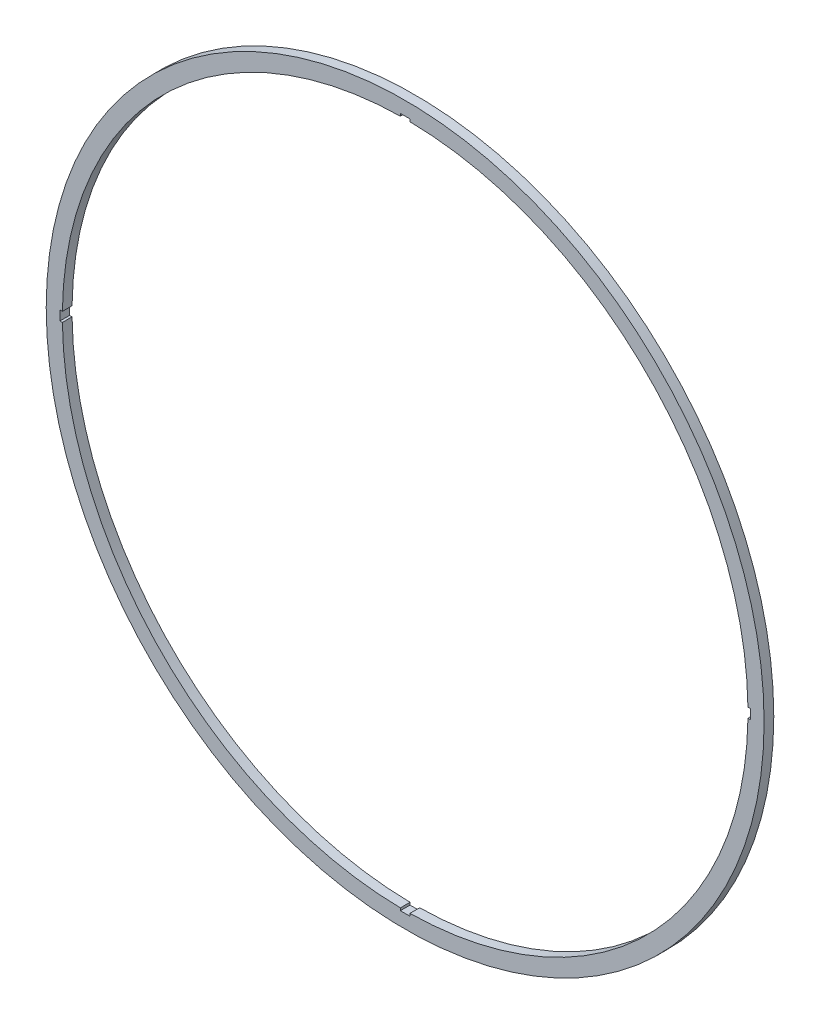
ISO-10303-21;
HEADER;
FILE_DESCRIPTION(('STEP AP214'),'2;1');
FILE_NAME('part.step','',(''),(''),'','','');
FILE_SCHEMA(('AUTOMOTIVE_DESIGN { 1 0 10303 214 1 1 1 1 }'));
ENDSEC;
DATA;
#1=APPLICATION_CONTEXT('core data for automotive mechanical design processes');
#2=APPLICATION_PROTOCOL_DEFINITION('international standard','automotive_design',2000,#1);
#3=PRODUCT_CONTEXT('',#1,'mechanical');
#4=PRODUCT('Part','Part','',(#3));
#5=PRODUCT_RELATED_PRODUCT_CATEGORY('part','',(#4));
#6=PRODUCT_DEFINITION_FORMATION('','',#4);
#7=PRODUCT_DEFINITION_CONTEXT('part definition',#1,'design');
#8=PRODUCT_DEFINITION('design','',#6,#7);
#9=PRODUCT_DEFINITION_SHAPE('','',#8);
#10=(LENGTH_UNIT() NAMED_UNIT(*) SI_UNIT(.MILLI.,.METRE.));
#11=(NAMED_UNIT(*) PLANE_ANGLE_UNIT() SI_UNIT($,.RADIAN.));
#12=(NAMED_UNIT(*) SI_UNIT($,.STERADIAN.) SOLID_ANGLE_UNIT());
#13=UNCERTAINTY_MEASURE_WITH_UNIT(LENGTH_MEASURE(1.E-05),#10,'distance_accuracy_value','');
#14=(GEOMETRIC_REPRESENTATION_CONTEXT(3) GLOBAL_UNCERTAINTY_ASSIGNED_CONTEXT((#13)) GLOBAL_UNIT_ASSIGNED_CONTEXT((#10,
#11,#12)) REPRESENTATION_CONTEXT('',''));
#15=CARTESIAN_POINT('',(0.,0.,0.));
#16=DIRECTION('',(0.,0.,1.));
#17=DIRECTION('',(1.,0.,0.));
#18=AXIS2_PLACEMENT_3D('',#15,#16,#17);
#19=CARTESIAN_POINT('',(0.,0.,12.));
#20=DIRECTION('',(0.,0.,1.));
#21=DIRECTION('',(1.,0.,0.));
#22=AXIS2_PLACEMENT_3D('',#19,#20,#21);
#23=PLANE('',#22);
#24=CARTESIAN_POINT('',(0.,0.,12.));
#25=DIRECTION('',(0.,0.,1.));
#26=DIRECTION('',(1.,0.,0.));
#27=AXIS2_PLACEMENT_3D('',#24,#25,#26);
#28=CIRCLE('',#27,445.);
#29=CARTESIAN_POINT('',(445.,0.,12.));
#30=VERTEX_POINT('',#29);
#31=EDGE_CURVE('E11',#30,#30,#28,.T.);
#32=ORIENTED_EDGE('',*,*,#31,.T.);
#33=EDGE_LOOP('',(#32));
#34=FACE_BOUND('',#33,.T.);
#35=CARTESIAN_POINT('',(0.,0.,12.));
#36=DIRECTION('',(0.,0.,1.));
#37=DIRECTION('',(1.,0.,0.));
#38=AXIS2_PLACEMENT_3D('',#35,#36,#37);
#39=CIRCLE('',#38,425.);
#40=CARTESIAN_POINT('',(-5.93023255813946,424.958624270418,12.));
#41=VERTEX_POINT('',#40);
#42=CARTESIAN_POINT('',(-424.958624270418,5.930232558121,12.));
#43=VERTEX_POINT('',#42);
#44=EDGE_CURVE('E162',#41,#43,#39,.T.);
#45=ORIENTED_EDGE('',*,*,#44,.F.);
#46=DIRECTION('',(0.,-1.,0.));
#47=VECTOR('',#46,1.);
#48=CARTESIAN_POINT('',(-5.93023255813949,428.000486773308,12.));
#49=LINE('',#48,#47);
#50=CARTESIAN_POINT('',(-5.93023255813949,428.000486773308,12.));
#51=VERTEX_POINT('',#50);
#52=EDGE_CURVE('E153',#51,#41,#49,.T.);
#53=ORIENTED_EDGE('',*,*,#52,.F.);
#54=DIRECTION('',(-1.,0.,0.));
#55=VECTOR('',#54,1.);
#56=CARTESIAN_POINT('',(-5.93023255813949,428.000486773308,12.));
#57=LINE('',#56,#55);
#58=CARTESIAN_POINT('',(5.93023255812108,428.000486773308,12.));
#59=VERTEX_POINT('',#58);
#60=EDGE_CURVE('E217',#59,#51,#57,.T.);
#61=ORIENTED_EDGE('',*,*,#60,.F.);
#62=DIRECTION('',(0.,1.,0.));
#63=VECTOR('',#62,1.);
#64=CARTESIAN_POINT('',(5.93023255812108,428.000486773308,12.));
#65=LINE('',#64,#63);
#66=CARTESIAN_POINT('',(5.93023255812108,424.958624270418,12.));
#67=VERTEX_POINT('',#66);
#68=EDGE_CURVE('E214',#67,#59,#65,.T.);
#69=ORIENTED_EDGE('',*,*,#68,.F.);
#70=CARTESIAN_POINT('',(0.,0.,12.));
#71=DIRECTION('',(0.,0.,1.));
#72=DIRECTION('',(1.,0.,0.));
#73=AXIS2_PLACEMENT_3D('',#70,#71,#72);
#74=CIRCLE('',#73,425.);
#75=CARTESIAN_POINT('',(424.958624270418,5.93023255813952,12.));
#76=VERTEX_POINT('',#75);
#77=EDGE_CURVE('E211',#76,#67,#74,.T.);
#78=ORIENTED_EDGE('',*,*,#77,.F.);
#79=DIRECTION('',(-1.,0.,0.));
#80=VECTOR('',#79,1.);
#81=CARTESIAN_POINT('',(428.000486773308,5.93023255813952,12.));
#82=LINE('',#81,#80);
#83=CARTESIAN_POINT('',(428.000486773308,5.93023255813952,12.));
#84=VERTEX_POINT('',#83);
#85=EDGE_CURVE('E208',#84,#76,#82,.T.);
#86=ORIENTED_EDGE('',*,*,#85,.F.);
#87=DIRECTION('',(0.,1.,0.));
#88=VECTOR('',#87,1.);
#89=CARTESIAN_POINT('',(428.000486773308,5.93023255813952,12.));
#90=LINE('',#89,#88);
#91=CARTESIAN_POINT('',(428.000486773308,-5.93023255812105,12.));
#92=VERTEX_POINT('',#91);
#93=EDGE_CURVE('E205',#92,#84,#90,.T.);
#94=ORIENTED_EDGE('',*,*,#93,.F.);
#95=DIRECTION('',(1.,0.,0.));
#96=VECTOR('',#95,1.);
#97=CARTESIAN_POINT('',(428.000486773308,-5.93023255812105,12.));
#98=LINE('',#97,#96);
#99=CARTESIAN_POINT('',(424.958624270418,-5.93023255812105,12.));
#100=VERTEX_POINT('',#99);
#101=EDGE_CURVE('E202',#100,#92,#98,.T.);
#102=ORIENTED_EDGE('',*,*,#101,.F.);
#103=CARTESIAN_POINT('',(0.,0.,12.));
#104=DIRECTION('',(0.,0.,1.));
#105=DIRECTION('',(1.,0.,0.));
#106=AXIS2_PLACEMENT_3D('',#103,#104,#105);
#107=CIRCLE('',#106,425.);
#108=CARTESIAN_POINT('',(5.93023255813959,-424.958624270418,12.));
#109=VERTEX_POINT('',#108);
#110=EDGE_CURVE('E199',#109,#100,#107,.T.);
#111=ORIENTED_EDGE('',*,*,#110,.F.);
#112=DIRECTION('',(0.,1.,0.));
#113=VECTOR('',#112,1.);
#114=CARTESIAN_POINT('',(5.93023255813955,-428.000486773308,12.));
#115=LINE('',#114,#113);
#116=CARTESIAN_POINT('',(5.93023255813955,-428.000486773308,12.));
#117=VERTEX_POINT('',#116);
#118=EDGE_CURVE('E196',#117,#109,#115,.T.);
#119=ORIENTED_EDGE('',*,*,#118,.F.);
#120=DIRECTION('',(1.,0.,0.));
#121=VECTOR('',#120,1.);
#122=CARTESIAN_POINT('',(5.93023255813955,-428.000486773308,12.));
#123=LINE('',#122,#121);
#124=CARTESIAN_POINT('',(-5.93023255812103,-428.000486773308,12.));
#125=VERTEX_POINT('',#124);
#126=EDGE_CURVE('E193',#125,#117,#123,.T.);
#127=ORIENTED_EDGE('',*,*,#126,.F.);
#128=DIRECTION('',(0.,-1.,0.));
#129=VECTOR('',#128,1.);
#130=CARTESIAN_POINT('',(-5.93023255812103,-428.000486773308,12.));
#131=LINE('',#130,#129);
#132=CARTESIAN_POINT('',(-5.93023255812103,-424.958624270418,12.));
#133=VERTEX_POINT('',#132);
#134=EDGE_CURVE('E190',#133,#125,#131,.T.);
#135=ORIENTED_EDGE('',*,*,#134,.F.);
#136=CARTESIAN_POINT('',(0.,0.,12.));
#137=DIRECTION('',(0.,0.,1.));
#138=DIRECTION('',(1.,0.,0.));
#139=AXIS2_PLACEMENT_3D('',#136,#137,#138);
#140=CIRCLE('',#139,425.);
#141=CARTESIAN_POINT('',(-424.958624270418,-5.93023255813943,12.));
#142=VERTEX_POINT('',#141);
#143=EDGE_CURVE('E187',#142,#133,#140,.T.);
#144=ORIENTED_EDGE('',*,*,#143,.F.);
#145=DIRECTION('',(1.,0.,0.));
#146=VECTOR('',#145,1.);
#147=CARTESIAN_POINT('',(-428.000486773308,-5.93023255813957,12.));
#148=LINE('',#147,#146);
#149=CARTESIAN_POINT('',(-428.000486773308,-5.93023255813957,12.));
#150=VERTEX_POINT('',#149);
#151=EDGE_CURVE('E184',#150,#142,#148,.T.);
#152=ORIENTED_EDGE('',*,*,#151,.F.);
#153=DIRECTION('',(0.,-1.,0.));
#154=VECTOR('',#153,1.);
#155=CARTESIAN_POINT('',(-428.000486773308,-5.93023255813957,12.));
#156=LINE('',#155,#154);
#157=CARTESIAN_POINT('',(-428.000486773308,5.930232558121,12.));
#158=VERTEX_POINT('',#157);
#159=EDGE_CURVE('E179',#158,#150,#156,.T.);
#160=ORIENTED_EDGE('',*,*,#159,.F.);
#161=DIRECTION('',(-1.,0.,0.));
#162=VECTOR('',#161,1.);
#163=CARTESIAN_POINT('',(-428.000486773308,5.930232558121,12.));
#164=LINE('',#163,#162);
#165=EDGE_CURVE('E175',#43,#158,#164,.T.);
#166=ORIENTED_EDGE('',*,*,#165,.F.);
#167=EDGE_LOOP('',(#45,#53,#61,#69,#78,#86,#94,#102,#111,#119,#127,#135,#144,#152,#160,#166));
#168=FACE_BOUND('',#167,.T.);
#169=ADVANCED_FACE('F39',(#34,#168),#23,.T.);
#170=CARTESIAN_POINT('',(0.,0.,0.));
#171=DIRECTION('',(0.,0.,1.));
#172=DIRECTION('',(1.,0.,0.));
#173=AXIS2_PLACEMENT_3D('',#170,#171,#172);
#174=PLANE('',#173);
#175=CARTESIAN_POINT('',(0.,0.,0.));
#176=DIRECTION('',(0.,0.,1.));
#177=DIRECTION('',(1.,0.,0.));
#178=AXIS2_PLACEMENT_3D('',#175,#176,#177);
#179=CIRCLE('',#178,445.);
#180=CARTESIAN_POINT('',(445.,0.,0.));
#181=VERTEX_POINT('',#180);
#182=EDGE_CURVE('E43',#181,#181,#179,.T.);
#183=ORIENTED_EDGE('',*,*,#182,.F.);
#184=EDGE_LOOP('',(#183));
#185=FACE_BOUND('',#184,.T.);
#186=DIRECTION('',(0.,-1.,0.));
#187=VECTOR('',#186,1.);
#188=CARTESIAN_POINT('',(-5.93023255813949,428.000486773308,0.));
#189=LINE('',#188,#187);
#190=CARTESIAN_POINT('',(-5.93023255813949,428.000486773308,0.));
#191=VERTEX_POINT('',#190);
#192=CARTESIAN_POINT('',(-5.93023255813946,424.958624270418,0.));
#193=VERTEX_POINT('',#192);
#194=EDGE_CURVE('E63',#191,#193,#189,.T.);
#195=ORIENTED_EDGE('',*,*,#194,.T.);
#196=CARTESIAN_POINT('',(0.,0.,0.));
#197=DIRECTION('',(0.,0.,1.));
#198=DIRECTION('',(1.,0.,0.));
#199=AXIS2_PLACEMENT_3D('',#196,#197,#198);
#200=CIRCLE('',#199,425.);
#201=CARTESIAN_POINT('',(-424.958624270418,5.930232558121,0.));
#202=VERTEX_POINT('',#201);
#203=EDGE_CURVE('E169',#193,#202,#200,.T.);
#204=ORIENTED_EDGE('',*,*,#203,.T.);
#205=DIRECTION('',(-1.,0.,0.));
#206=VECTOR('',#205,1.);
#207=CARTESIAN_POINT('',(-428.000486773308,5.930232558121,0.));
#208=LINE('',#207,#206);
#209=CARTESIAN_POINT('',(-428.000486773308,5.930232558121,0.));
#210=VERTEX_POINT('',#209);
#211=EDGE_CURVE('E224',#202,#210,#208,.T.);
#212=ORIENTED_EDGE('',*,*,#211,.T.);
#213=DIRECTION('',(0.,-1.,0.));
#214=VECTOR('',#213,1.);
#215=CARTESIAN_POINT('',(-428.000486773308,-5.93023255813957,0.));
#216=LINE('',#215,#214);
#217=CARTESIAN_POINT('',(-428.000486773308,-5.93023255813957,0.));
#218=VERTEX_POINT('',#217);
#219=EDGE_CURVE('E228',#210,#218,#216,.T.);
#220=ORIENTED_EDGE('',*,*,#219,.T.);
#221=DIRECTION('',(1.,0.,0.));
#222=VECTOR('',#221,1.);
#223=CARTESIAN_POINT('',(-428.000486773308,-5.93023255813957,0.));
#224=LINE('',#223,#222);
#225=CARTESIAN_POINT('',(-424.958624270418,-5.93023255813943,0.));
#226=VERTEX_POINT('',#225);
#227=EDGE_CURVE('E232',#218,#226,#224,.T.);
#228=ORIENTED_EDGE('',*,*,#227,.T.);
#229=CARTESIAN_POINT('',(0.,0.,0.));
#230=DIRECTION('',(0.,0.,1.));
#231=DIRECTION('',(1.,0.,0.));
#232=AXIS2_PLACEMENT_3D('',#229,#230,#231);
#233=CIRCLE('',#232,425.);
#234=CARTESIAN_POINT('',(-5.93023255812103,-424.958624270418,0.));
#235=VERTEX_POINT('',#234);
#236=EDGE_CURVE('E236',#226,#235,#233,.T.);
#237=ORIENTED_EDGE('',*,*,#236,.T.);
#238=DIRECTION('',(0.,-1.,0.));
#239=VECTOR('',#238,1.);
#240=CARTESIAN_POINT('',(-5.93023255812103,-428.000486773308,0.));
#241=LINE('',#240,#239);
#242=CARTESIAN_POINT('',(-5.93023255812103,-428.000486773308,0.));
#243=VERTEX_POINT('',#242);
#244=EDGE_CURVE('E240',#235,#243,#241,.T.);
#245=ORIENTED_EDGE('',*,*,#244,.T.);
#246=DIRECTION('',(1.,0.,0.));
#247=VECTOR('',#246,1.);
#248=CARTESIAN_POINT('',(5.93023255813955,-428.000486773308,0.));
#249=LINE('',#248,#247);
#250=CARTESIAN_POINT('',(5.93023255813955,-428.000486773308,0.));
#251=VERTEX_POINT('',#250);
#252=EDGE_CURVE('E244',#243,#251,#249,.T.);
#253=ORIENTED_EDGE('',*,*,#252,.T.);
#254=DIRECTION('',(0.,1.,0.));
#255=VECTOR('',#254,1.);
#256=CARTESIAN_POINT('',(5.93023255813955,-428.000486773308,0.));
#257=LINE('',#256,#255);
#258=CARTESIAN_POINT('',(5.93023255813959,-424.958624270418,0.));
#259=VERTEX_POINT('',#258);
#260=EDGE_CURVE('E248',#251,#259,#257,.T.);
#261=ORIENTED_EDGE('',*,*,#260,.T.);
#262=CARTESIAN_POINT('',(0.,0.,0.));
#263=DIRECTION('',(0.,0.,1.));
#264=DIRECTION('',(1.,0.,0.));
#265=AXIS2_PLACEMENT_3D('',#262,#263,#264);
#266=CIRCLE('',#265,425.);
#267=CARTESIAN_POINT('',(424.958624270418,-5.93023255812105,0.));
#268=VERTEX_POINT('',#267);
#269=EDGE_CURVE('E252',#259,#268,#266,.T.);
#270=ORIENTED_EDGE('',*,*,#269,.T.);
#271=DIRECTION('',(1.,0.,0.));
#272=VECTOR('',#271,1.);
#273=CARTESIAN_POINT('',(428.000486773308,-5.93023255812105,0.));
#274=LINE('',#273,#272);
#275=CARTESIAN_POINT('',(428.000486773308,-5.93023255812105,0.));
#276=VERTEX_POINT('',#275);
#277=EDGE_CURVE('E256',#268,#276,#274,.T.);
#278=ORIENTED_EDGE('',*,*,#277,.T.);
#279=DIRECTION('',(0.,1.,0.));
#280=VECTOR('',#279,1.);
#281=CARTESIAN_POINT('',(428.000486773308,5.93023255813952,0.));
#282=LINE('',#281,#280);
#283=CARTESIAN_POINT('',(428.000486773308,5.93023255813952,0.));
#284=VERTEX_POINT('',#283);
#285=EDGE_CURVE('E260',#276,#284,#282,.T.);
#286=ORIENTED_EDGE('',*,*,#285,.T.);
#287=DIRECTION('',(-1.,0.,0.));
#288=VECTOR('',#287,1.);
#289=CARTESIAN_POINT('',(428.000486773308,5.93023255813952,0.));
#290=LINE('',#289,#288);
#291=CARTESIAN_POINT('',(424.958624270418,5.93023255813952,0.));
#292=VERTEX_POINT('',#291);
#293=EDGE_CURVE('E264',#284,#292,#290,.T.);
#294=ORIENTED_EDGE('',*,*,#293,.T.);
#295=CARTESIAN_POINT('',(0.,0.,0.));
#296=DIRECTION('',(0.,0.,1.));
#297=DIRECTION('',(1.,0.,0.));
#298=AXIS2_PLACEMENT_3D('',#295,#296,#297);
#299=CIRCLE('',#298,425.);
#300=CARTESIAN_POINT('',(5.93023255812108,424.958624270418,0.));
#301=VERTEX_POINT('',#300);
#302=EDGE_CURVE('E268',#292,#301,#299,.T.);
#303=ORIENTED_EDGE('',*,*,#302,.T.);
#304=DIRECTION('',(0.,1.,0.));
#305=VECTOR('',#304,1.);
#306=CARTESIAN_POINT('',(5.93023255812108,428.000486773308,0.));
#307=LINE('',#306,#305);
#308=CARTESIAN_POINT('',(5.93023255812108,428.000486773308,0.));
#309=VERTEX_POINT('',#308);
#310=EDGE_CURVE('E272',#301,#309,#307,.T.);
#311=ORIENTED_EDGE('',*,*,#310,.T.);
#312=DIRECTION('',(-1.,0.,0.));
#313=VECTOR('',#312,1.);
#314=CARTESIAN_POINT('',(-5.93023255813949,428.000486773308,0.));
#315=LINE('',#314,#313);
#316=EDGE_CURVE('E163',#309,#191,#315,.T.);
#317=ORIENTED_EDGE('',*,*,#316,.T.);
#318=EDGE_LOOP('',(#195,#204,#212,#220,#228,#237,#245,#253,#261,#270,#278,#286,#294,#303,#311,#317));
#319=FACE_BOUND('',#318,.T.);
#320=ADVANCED_FACE('F326',(#185,#319),#174,.F.);
#321=CARTESIAN_POINT('',(0.,0.,12.));
#322=DIRECTION('',(0.,0.,-1.));
#323=DIRECTION('',(-1.,0.,0.));
#324=AXIS2_PLACEMENT_3D('',#321,#322,#323);
#325=CYLINDRICAL_SURFACE('',#324,445.);
#326=ORIENTED_EDGE('',*,*,#31,.F.);
#327=EDGE_LOOP('',(#326));
#328=FACE_BOUND('',#327,.T.);
#329=ORIENTED_EDGE('',*,*,#182,.T.);
#330=EDGE_LOOP('',(#329));
#331=FACE_BOUND('',#330,.T.);
#332=ADVANCED_FACE('F41',(#328,#331),#325,.T.);
#333=CARTESIAN_POINT('',(-5.93023255813949,428.000486773308,12.));
#334=DIRECTION('',(1.,0.,0.));
#335=DIRECTION('',(0.,0.,-1.));
#336=AXIS2_PLACEMENT_3D('',#333,#334,#335);
#337=PLANE('',#336);
#338=ORIENTED_EDGE('',*,*,#194,.F.);
#339=DIRECTION('',(0.,0.,-1.));
#340=VECTOR('',#339,1.);
#341=CARTESIAN_POINT('',(-5.93023255813949,428.000486773308,12.));
#342=LINE('',#341,#340);
#343=EDGE_CURVE('E157',#51,#191,#342,.T.);
#344=ORIENTED_EDGE('',*,*,#343,.F.);
#345=ORIENTED_EDGE('',*,*,#52,.T.);
#346=DIRECTION('',(0.,0.,-1.));
#347=VECTOR('',#346,1.);
#348=CARTESIAN_POINT('',(-5.93023255813946,424.958624270418,12.));
#349=LINE('',#348,#347);
#350=EDGE_CURVE('E156',#41,#193,#349,.T.);
#351=ORIENTED_EDGE('',*,*,#350,.T.);
#352=EDGE_LOOP('',(#338,#344,#345,#351));
#353=FACE_BOUND('',#352,.T.);
#354=ADVANCED_FACE('F155',(#353),#337,.T.);
#355=CARTESIAN_POINT('',(0.,0.,12.));
#356=DIRECTION('',(0.,0.,-1.));
#357=DIRECTION('',(-1.,0.,0.));
#358=AXIS2_PLACEMENT_3D('',#355,#356,#357);
#359=CYLINDRICAL_SURFACE('',#358,425.);
#360=ORIENTED_EDGE('',*,*,#203,.F.);
#361=ORIENTED_EDGE('',*,*,#350,.F.);
#362=ORIENTED_EDGE('',*,*,#44,.T.);
#363=DIRECTION('',(0.,0.,-1.));
#364=VECTOR('',#363,1.);
#365=CARTESIAN_POINT('',(-424.958624270418,5.930232558121,12.));
#366=LINE('',#365,#364);
#367=EDGE_CURVE('E171',#43,#202,#366,.T.);
#368=ORIENTED_EDGE('',*,*,#367,.T.);
#369=EDGE_LOOP('',(#360,#361,#362,#368));
#370=FACE_BOUND('',#369,.T.);
#371=ADVANCED_FACE('F166',(#370),#359,.F.);
#372=CARTESIAN_POINT('',(-428.000486773308,5.930232558121,12.));
#373=DIRECTION('',(0.,-1.,0.));
#374=DIRECTION('',(1.,0.,0.));
#375=AXIS2_PLACEMENT_3D('',#372,#373,#374);
#376=PLANE('',#375);
#377=ORIENTED_EDGE('',*,*,#211,.F.);
#378=ORIENTED_EDGE('',*,*,#367,.F.);
#379=ORIENTED_EDGE('',*,*,#165,.T.);
#380=DIRECTION('',(0.,0.,-1.));
#381=VECTOR('',#380,1.);
#382=CARTESIAN_POINT('',(-428.000486773308,5.930232558121,12.));
#383=LINE('',#382,#381);
#384=EDGE_CURVE('E316',#158,#210,#383,.T.);
#385=ORIENTED_EDGE('',*,*,#384,.T.);
#386=EDGE_LOOP('',(#377,#378,#379,#385));
#387=FACE_BOUND('',#386,.T.);
#388=ADVANCED_FACE('F322',(#387),#376,.T.);
#389=CARTESIAN_POINT('',(-428.000486773308,-5.93023255813957,12.));
#390=DIRECTION('',(1.,0.,0.));
#391=DIRECTION('',(0.,0.,-1.));
#392=AXIS2_PLACEMENT_3D('',#389,#390,#391);
#393=PLANE('',#392);
#394=ORIENTED_EDGE('',*,*,#219,.F.);
#395=ORIENTED_EDGE('',*,*,#384,.F.);
#396=ORIENTED_EDGE('',*,*,#159,.T.);
#397=DIRECTION('',(0.,0.,-1.));
#398=VECTOR('',#397,1.);
#399=CARTESIAN_POINT('',(-428.000486773308,-5.93023255813957,12.));
#400=LINE('',#399,#398);
#401=EDGE_CURVE('E313',#150,#218,#400,.T.);
#402=ORIENTED_EDGE('',*,*,#401,.T.);
#403=EDGE_LOOP('',(#394,#395,#396,#402));
#404=FACE_BOUND('',#403,.T.);
#405=ADVANCED_FACE('F384',(#404),#393,.T.);
#406=CARTESIAN_POINT('',(-428.000486773308,-5.93023255813957,12.));
#407=DIRECTION('',(0.,1.,0.));
#408=DIRECTION('',(-1.,0.,0.));
#409=AXIS2_PLACEMENT_3D('',#406,#407,#408);
#410=PLANE('',#409);
#411=ORIENTED_EDGE('',*,*,#227,.F.);
#412=ORIENTED_EDGE('',*,*,#401,.F.);
#413=ORIENTED_EDGE('',*,*,#151,.T.);
#414=DIRECTION('',(0.,0.,-1.));
#415=VECTOR('',#414,1.);
#416=CARTESIAN_POINT('',(-424.958624270418,-5.93023255813943,12.));
#417=LINE('',#416,#415);
#418=EDGE_CURVE('E310',#142,#226,#417,.T.);
#419=ORIENTED_EDGE('',*,*,#418,.T.);
#420=EDGE_LOOP('',(#411,#412,#413,#419));
#421=FACE_BOUND('',#420,.T.);
#422=ADVANCED_FACE('F381',(#421),#410,.T.);
#423=CARTESIAN_POINT('',(0.,0.,12.));
#424=DIRECTION('',(0.,0.,-1.));
#425=DIRECTION('',(-1.,0.,0.));
#426=AXIS2_PLACEMENT_3D('',#423,#424,#425);
#427=CYLINDRICAL_SURFACE('',#426,425.);
#428=ORIENTED_EDGE('',*,*,#236,.F.);
#429=ORIENTED_EDGE('',*,*,#418,.F.);
#430=ORIENTED_EDGE('',*,*,#143,.T.);
#431=DIRECTION('',(0.,0.,-1.));
#432=VECTOR('',#431,1.);
#433=CARTESIAN_POINT('',(-5.93023255812103,-424.958624270418,12.));
#434=LINE('',#433,#432);
#435=EDGE_CURVE('E307',#133,#235,#434,.T.);
#436=ORIENTED_EDGE('',*,*,#435,.T.);
#437=EDGE_LOOP('',(#428,#429,#430,#436));
#438=FACE_BOUND('',#437,.T.);
#439=ADVANCED_FACE('F378',(#438),#427,.F.);
#440=CARTESIAN_POINT('',(-5.93023255812103,-428.000486773308,12.));
#441=DIRECTION('',(1.,0.,0.));
#442=DIRECTION('',(0.,1.,0.));
#443=AXIS2_PLACEMENT_3D('',#440,#441,#442);
#444=PLANE('',#443);
#445=ORIENTED_EDGE('',*,*,#244,.F.);
#446=ORIENTED_EDGE('',*,*,#435,.F.);
#447=ORIENTED_EDGE('',*,*,#134,.T.);
#448=DIRECTION('',(0.,0.,-1.));
#449=VECTOR('',#448,1.);
#450=CARTESIAN_POINT('',(-5.93023255812103,-428.000486773308,12.));
#451=LINE('',#450,#449);
#452=EDGE_CURVE('E304',#125,#243,#451,.T.);
#453=ORIENTED_EDGE('',*,*,#452,.T.);
#454=EDGE_LOOP('',(#445,#446,#447,#453));
#455=FACE_BOUND('',#454,.T.);
#456=ADVANCED_FACE('F371',(#455),#444,.T.);
#457=CARTESIAN_POINT('',(5.93023255813955,-428.000486773308,12.));
#458=DIRECTION('',(0.,1.,0.));
#459=DIRECTION('',(0.,0.,1.));
#460=AXIS2_PLACEMENT_3D('',#457,#458,#459);
#461=PLANE('',#460);
#462=ORIENTED_EDGE('',*,*,#252,.F.);
#463=ORIENTED_EDGE('',*,*,#452,.F.);
#464=ORIENTED_EDGE('',*,*,#126,.T.);
#465=DIRECTION('',(0.,0.,-1.));
#466=VECTOR('',#465,1.);
#467=CARTESIAN_POINT('',(5.93023255813955,-428.000486773308,12.));
#468=LINE('',#467,#466);
#469=EDGE_CURVE('E301',#117,#251,#468,.T.);
#470=ORIENTED_EDGE('',*,*,#469,.T.);
#471=EDGE_LOOP('',(#462,#463,#464,#470));
#472=FACE_BOUND('',#471,.T.);
#473=ADVANCED_FACE('F367',(#472),#461,.T.);
#474=CARTESIAN_POINT('',(5.93023255813955,-428.000486773308,12.));
#475=DIRECTION('',(-1.,0.,0.));
#476=DIRECTION('',(0.,-1.,0.));
#477=AXIS2_PLACEMENT_3D('',#474,#475,#476);
#478=PLANE('',#477);
#479=ORIENTED_EDGE('',*,*,#260,.F.);
#480=ORIENTED_EDGE('',*,*,#469,.F.);
#481=ORIENTED_EDGE('',*,*,#118,.T.);
#482=DIRECTION('',(0.,0.,-1.));
#483=VECTOR('',#482,1.);
#484=CARTESIAN_POINT('',(5.93023255813959,-424.958624270418,12.));
#485=LINE('',#484,#483);
#486=EDGE_CURVE('E298',#109,#259,#485,.T.);
#487=ORIENTED_EDGE('',*,*,#486,.T.);
#488=EDGE_LOOP('',(#479,#480,#481,#487));
#489=FACE_BOUND('',#488,.T.);
#490=ADVANCED_FACE('F364',(#489),#478,.T.);
#491=CARTESIAN_POINT('',(0.,0.,12.));
#492=DIRECTION('',(0.,0.,-1.));
#493=DIRECTION('',(-1.,0.,0.));
#494=AXIS2_PLACEMENT_3D('',#491,#492,#493);
#495=CYLINDRICAL_SURFACE('',#494,425.);
#496=ORIENTED_EDGE('',*,*,#269,.F.);
#497=ORIENTED_EDGE('',*,*,#486,.F.);
#498=ORIENTED_EDGE('',*,*,#110,.T.);
#499=DIRECTION('',(0.,0.,-1.));
#500=VECTOR('',#499,1.);
#501=CARTESIAN_POINT('',(424.958624270418,-5.93023255812105,12.));
#502=LINE('',#501,#500);
#503=EDGE_CURVE('E295',#100,#268,#502,.T.);
#504=ORIENTED_EDGE('',*,*,#503,.T.);
#505=EDGE_LOOP('',(#496,#497,#498,#504));
#506=FACE_BOUND('',#505,.T.);
#507=ADVANCED_FACE('F356',(#506),#495,.F.);
#508=CARTESIAN_POINT('',(428.000486773308,-5.93023255812105,12.));
#509=DIRECTION('',(0.,1.,0.));
#510=DIRECTION('',(-1.,0.,0.));
#511=AXIS2_PLACEMENT_3D('',#508,#509,#510);
#512=PLANE('',#511);
#513=ORIENTED_EDGE('',*,*,#277,.F.);
#514=ORIENTED_EDGE('',*,*,#503,.F.);
#515=ORIENTED_EDGE('',*,*,#101,.T.);
#516=DIRECTION('',(0.,0.,-1.));
#517=VECTOR('',#516,1.);
#518=CARTESIAN_POINT('',(428.000486773308,-5.93023255812105,12.));
#519=LINE('',#518,#517);
#520=EDGE_CURVE('E292',#92,#276,#519,.T.);
#521=ORIENTED_EDGE('',*,*,#520,.T.);
#522=EDGE_LOOP('',(#513,#514,#515,#521));
#523=FACE_BOUND('',#522,.T.);
#524=ADVANCED_FACE('F352',(#523),#512,.T.);
#525=CARTESIAN_POINT('',(428.000486773308,5.93023255813952,12.));
#526=DIRECTION('',(-1.,0.,0.));
#527=DIRECTION('',(0.,0.,1.));
#528=AXIS2_PLACEMENT_3D('',#525,#526,#527);
#529=PLANE('',#528);
#530=ORIENTED_EDGE('',*,*,#285,.F.);
#531=ORIENTED_EDGE('',*,*,#520,.F.);
#532=ORIENTED_EDGE('',*,*,#93,.T.);
#533=DIRECTION('',(0.,0.,-1.));
#534=VECTOR('',#533,1.);
#535=CARTESIAN_POINT('',(428.000486773308,5.93023255813952,12.));
#536=LINE('',#535,#534);
#537=EDGE_CURVE('E289',#84,#284,#536,.T.);
#538=ORIENTED_EDGE('',*,*,#537,.T.);
#539=EDGE_LOOP('',(#530,#531,#532,#538));
#540=FACE_BOUND('',#539,.T.);
#541=ADVANCED_FACE('F349',(#540),#529,.T.);
#542=CARTESIAN_POINT('',(428.000486773308,5.93023255813952,12.));
#543=DIRECTION('',(0.,-1.,0.));
#544=DIRECTION('',(1.,0.,0.));
#545=AXIS2_PLACEMENT_3D('',#542,#543,#544);
#546=PLANE('',#545);
#547=ORIENTED_EDGE('',*,*,#293,.F.);
#548=ORIENTED_EDGE('',*,*,#537,.F.);
#549=ORIENTED_EDGE('',*,*,#85,.T.);
#550=DIRECTION('',(0.,0.,-1.));
#551=VECTOR('',#550,1.);
#552=CARTESIAN_POINT('',(424.958624270418,5.93023255813952,12.));
#553=LINE('',#552,#551);
#554=EDGE_CURVE('E286',#76,#292,#553,.T.);
#555=ORIENTED_EDGE('',*,*,#554,.T.);
#556=EDGE_LOOP('',(#547,#548,#549,#555));
#557=FACE_BOUND('',#556,.T.);
#558=ADVANCED_FACE('F341',(#557),#546,.T.);
#559=CARTESIAN_POINT('',(0.,0.,12.));
#560=DIRECTION('',(0.,0.,-1.));
#561=DIRECTION('',(-1.,0.,0.));
#562=AXIS2_PLACEMENT_3D('',#559,#560,#561);
#563=CYLINDRICAL_SURFACE('',#562,425.);
#564=ORIENTED_EDGE('',*,*,#302,.F.);
#565=ORIENTED_EDGE('',*,*,#554,.F.);
#566=ORIENTED_EDGE('',*,*,#77,.T.);
#567=DIRECTION('',(0.,0.,-1.));
#568=VECTOR('',#567,1.);
#569=CARTESIAN_POINT('',(5.93023255812108,424.958624270418,12.));
#570=LINE('',#569,#568);
#571=EDGE_CURVE('E283',#67,#301,#570,.T.);
#572=ORIENTED_EDGE('',*,*,#571,.T.);
#573=EDGE_LOOP('',(#564,#565,#566,#572));
#574=FACE_BOUND('',#573,.T.);
#575=ADVANCED_FACE('F337',(#574),#563,.F.);
#576=CARTESIAN_POINT('',(5.93023255812108,428.000486773308,12.));
#577=DIRECTION('',(-1.,0.,0.));
#578=DIRECTION('',(0.,-1.,0.));
#579=AXIS2_PLACEMENT_3D('',#576,#577,#578);
#580=PLANE('',#579);
#581=ORIENTED_EDGE('',*,*,#310,.F.);
#582=ORIENTED_EDGE('',*,*,#571,.F.);
#583=ORIENTED_EDGE('',*,*,#68,.T.);
#584=DIRECTION('',(0.,0.,-1.));
#585=VECTOR('',#584,1.);
#586=CARTESIAN_POINT('',(5.93023255812108,428.000486773308,12.));
#587=LINE('',#586,#585);
#588=EDGE_CURVE('E55',#59,#309,#587,.T.);
#589=ORIENTED_EDGE('',*,*,#588,.T.);
#590=EDGE_LOOP('',(#581,#582,#583,#589));
#591=FACE_BOUND('',#590,.T.);
#592=ADVANCED_FACE('F334',(#591),#580,.T.);
#593=CARTESIAN_POINT('',(-5.93023255813949,428.000486773308,12.));
#594=DIRECTION('',(0.,-1.,0.));
#595=DIRECTION('',(0.,0.,-1.));
#596=AXIS2_PLACEMENT_3D('',#593,#594,#595);
#597=PLANE('',#596);
#598=ORIENTED_EDGE('',*,*,#316,.F.);
#599=ORIENTED_EDGE('',*,*,#588,.F.);
#600=ORIENTED_EDGE('',*,*,#60,.T.);
#601=ORIENTED_EDGE('',*,*,#343,.T.);
#602=EDGE_LOOP('',(#598,#599,#600,#601));
#603=FACE_BOUND('',#602,.T.);
#604=ADVANCED_FACE('F328',(#603),#597,.T.);
#605=CLOSED_SHELL('',(#169,#320,#332,#354,#371,#388,#405,#422,#439,#456,#473,#490,#507,#524,
#541,#558,#575,#592,#604));
#606=MANIFOLD_SOLID_BREP('B2',#605);
#607=ADVANCED_BREP_SHAPE_REPRESENTATION('',(#18,#606),#14);
#608=SHAPE_DEFINITION_REPRESENTATION(#9,#607);
ENDSEC;
END-ISO-10303-21;
